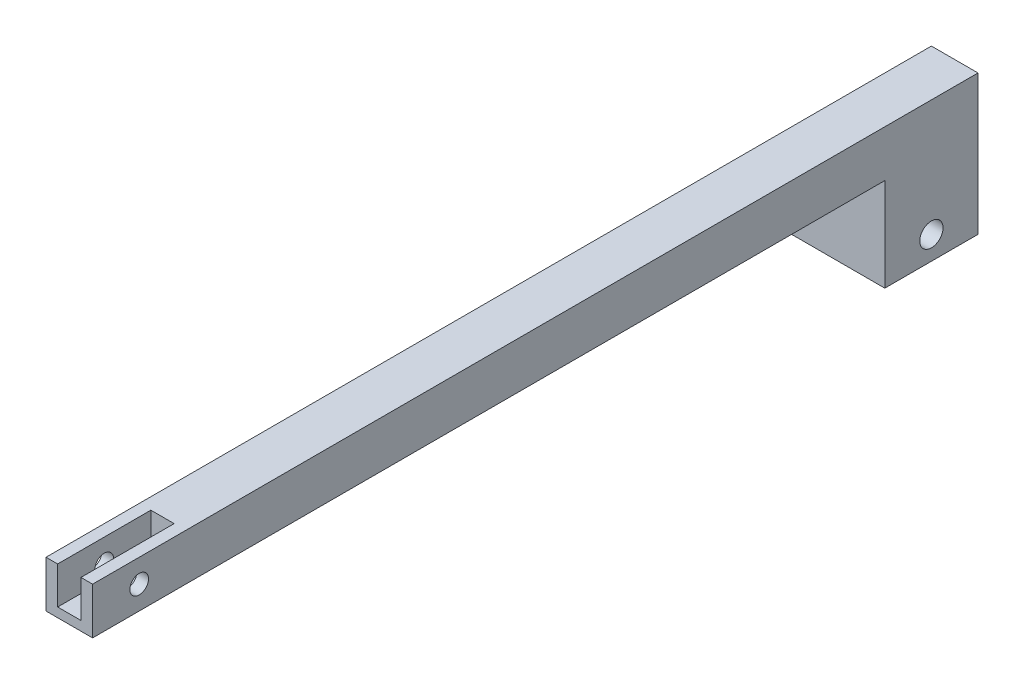
ISO-10303-21;
HEADER;
FILE_DESCRIPTION(('STEP AP214'),'2;1');
FILE_NAME('part.step','',(''),(''),'','','');
FILE_SCHEMA(('AUTOMOTIVE_DESIGN { 1 0 10303 214 1 1 1 1 }'));
ENDSEC;
DATA;
#1=APPLICATION_CONTEXT('core data for automotive mechanical design processes');
#2=APPLICATION_PROTOCOL_DEFINITION('international standard','automotive_design',2000,#1);
#3=PRODUCT_CONTEXT('',#1,'mechanical');
#4=PRODUCT('Part','Part','',(#3));
#5=PRODUCT_RELATED_PRODUCT_CATEGORY('part','',(#4));
#6=PRODUCT_DEFINITION_FORMATION('','',#4);
#7=PRODUCT_DEFINITION_CONTEXT('part definition',#1,'design');
#8=PRODUCT_DEFINITION('design','',#6,#7);
#9=PRODUCT_DEFINITION_SHAPE('','',#8);
#10=(LENGTH_UNIT() NAMED_UNIT(*) SI_UNIT(.MILLI.,.METRE.));
#11=(NAMED_UNIT(*) PLANE_ANGLE_UNIT() SI_UNIT($,.RADIAN.));
#12=(NAMED_UNIT(*) SI_UNIT($,.STERADIAN.) SOLID_ANGLE_UNIT());
#13=UNCERTAINTY_MEASURE_WITH_UNIT(LENGTH_MEASURE(1.E-05),#10,'distance_accuracy_value','');
#14=(GEOMETRIC_REPRESENTATION_CONTEXT(3) GLOBAL_UNCERTAINTY_ASSIGNED_CONTEXT((#13)) GLOBAL_UNIT_ASSIGNED_CONTEXT((#10,
#11,#12)) REPRESENTATION_CONTEXT('',''));
#15=CARTESIAN_POINT('',(0.,0.,0.));
#16=DIRECTION('',(0.,0.,1.));
#17=DIRECTION('',(1.,0.,0.));
#18=AXIS2_PLACEMENT_3D('',#15,#16,#17);
#19=CARTESIAN_POINT('',(0.,0.,190.));
#20=DIRECTION('',(0.,0.,-1.));
#21=DIRECTION('',(-1.,0.,0.));
#22=AXIS2_PLACEMENT_3D('',#19,#20,#21);
#23=PLANE('',#22);
#24=DIRECTION('',(1.,0.,0.));
#25=VECTOR('',#24,1.);
#26=CARTESIAN_POINT('',(12.5,22.,190.));
#27=LINE('',#26,#25);
#28=CARTESIAN_POINT('',(12.5,22.,190.));
#29=VERTEX_POINT('',#28);
#30=CARTESIAN_POINT('',(17.5,22.,190.));
#31=VERTEX_POINT('',#30);
#32=EDGE_CURVE('E146',#29,#31,#27,.T.);
#33=ORIENTED_EDGE('',*,*,#32,.F.);
#34=DIRECTION('',(0.,1.,0.));
#35=VECTOR('',#34,1.);
#36=CARTESIAN_POINT('',(12.5,25.,190.));
#37=LINE('',#36,#35);
#38=CARTESIAN_POINT('',(12.5,30.,190.));
#39=VERTEX_POINT('',#38);
#40=EDGE_CURVE('E130',#29,#39,#37,.T.);
#41=ORIENTED_EDGE('',*,*,#40,.T.);
#42=DIRECTION('',(-1.,0.,0.));
#43=VECTOR('',#42,1.);
#44=CARTESIAN_POINT('',(10.,30.,190.));
#45=LINE('',#44,#43);
#46=CARTESIAN_POINT('',(10.,30.,190.));
#47=VERTEX_POINT('',#46);
#48=EDGE_CURVE('E197',#39,#47,#45,.T.);
#49=ORIENTED_EDGE('',*,*,#48,.T.);
#50=DIRECTION('',(0.,-1.,0.));
#51=VECTOR('',#50,1.);
#52=CARTESIAN_POINT('',(10.,10.,190.));
#53=LINE('',#52,#51);
#54=CARTESIAN_POINT('',(10.,20.,190.));
#55=VERTEX_POINT('',#54);
#56=EDGE_CURVE('E201',#47,#55,#53,.T.);
#57=ORIENTED_EDGE('',*,*,#56,.T.);
#58=DIRECTION('',(-1.,0.,0.));
#59=VECTOR('',#58,1.);
#60=CARTESIAN_POINT('',(20.,20.,190.));
#61=LINE('',#60,#59);
#62=CARTESIAN_POINT('',(20.,20.,190.));
#63=VERTEX_POINT('',#62);
#64=EDGE_CURVE('E181',#63,#55,#61,.T.);
#65=ORIENTED_EDGE('',*,*,#64,.F.);
#66=DIRECTION('',(0.,1.,0.));
#67=VECTOR('',#66,1.);
#68=CARTESIAN_POINT('',(20.,30.,190.));
#69=LINE('',#68,#67);
#70=CARTESIAN_POINT('',(20.,30.,190.));
#71=VERTEX_POINT('',#70);
#72=EDGE_CURVE('E195',#63,#71,#69,.T.);
#73=ORIENTED_EDGE('',*,*,#72,.T.);
#74=CARTESIAN_POINT('',(17.5,30.,190.));
#75=VERTEX_POINT('',#74);
#76=EDGE_CURVE('E199',#71,#75,#45,.T.);
#77=ORIENTED_EDGE('',*,*,#76,.T.);
#78=DIRECTION('',(0.,1.,0.));
#79=VECTOR('',#78,1.);
#80=CARTESIAN_POINT('',(17.5,25.,190.));
#81=LINE('',#80,#79);
#82=EDGE_CURVE('E55',#31,#75,#81,.T.);
#83=ORIENTED_EDGE('',*,*,#82,.F.);
#84=EDGE_LOOP('',(#33,#41,#49,#57,#65,#73,#77,#83));
#85=FACE_BOUND('',#84,.T.);
#86=ADVANCED_FACE('F39',(#85),#23,.F.);
#87=CARTESIAN_POINT('',(20.,0.,190.));
#88=DIRECTION('',(0.,1.,0.));
#89=DIRECTION('',(-1.,0.,0.));
#90=AXIS2_PLACEMENT_3D('',#87,#88,#89);
#91=PLANE('',#90);
#92=DIRECTION('',(1.,0.,0.));
#93=VECTOR('',#92,1.);
#94=CARTESIAN_POINT('',(20.,0.,20.));
#95=LINE('',#94,#93);
#96=CARTESIAN_POINT('',(0.,0.,20.));
#97=VERTEX_POINT('',#96);
#98=CARTESIAN_POINT('',(20.,0.,20.));
#99=VERTEX_POINT('',#98);
#100=EDGE_CURVE('E179',#97,#99,#95,.T.);
#101=ORIENTED_EDGE('',*,*,#100,.F.);
#102=DIRECTION('',(0.,0.,-1.));
#103=VECTOR('',#102,1.);
#104=CARTESIAN_POINT('',(0.,0.,190.));
#105=LINE('',#104,#103);
#106=CARTESIAN_POINT('',(0.,0.,0.));
#107=VERTEX_POINT('',#106);
#108=EDGE_CURVE('E204',#97,#107,#105,.T.);
#109=ORIENTED_EDGE('',*,*,#108,.T.);
#110=DIRECTION('',(1.,0.,0.));
#111=VECTOR('',#110,1.);
#112=CARTESIAN_POINT('',(20.,0.,0.));
#113=LINE('',#112,#111);
#114=CARTESIAN_POINT('',(20.,0.,0.));
#115=VERTEX_POINT('',#114);
#116=EDGE_CURVE('E192',#107,#115,#113,.T.);
#117=ORIENTED_EDGE('',*,*,#116,.T.);
#118=DIRECTION('',(0.,0.,-1.));
#119=VECTOR('',#118,1.);
#120=CARTESIAN_POINT('',(20.,0.,190.));
#121=LINE('',#120,#119);
#122=EDGE_CURVE('E11',#99,#115,#121,.T.);
#123=ORIENTED_EDGE('',*,*,#122,.F.);
#124=EDGE_LOOP('',(#101,#109,#117,#123));
#125=FACE_BOUND('',#124,.T.);
#126=ADVANCED_FACE('F41',(#125),#91,.F.);
#127=CARTESIAN_POINT('',(20.,30.,190.));
#128=DIRECTION('',(-1.,0.,0.));
#129=DIRECTION('',(0.,-1.,0.));
#130=AXIS2_PLACEMENT_3D('',#127,#128,#129);
#131=PLANE('',#130);
#132=CARTESIAN_POINT('',(20.,25.,180.));
#133=DIRECTION('',(-1.,0.,0.));
#134=DIRECTION('',(0.,0.,1.));
#135=AXIS2_PLACEMENT_3D('',#132,#133,#134);
#136=CIRCLE('',#135,2.);
#137=CARTESIAN_POINT('',(20.,25.,182.));
#138=VERTEX_POINT('',#137);
#139=EDGE_CURVE('E301',#138,#138,#136,.T.);
#140=ORIENTED_EDGE('',*,*,#139,.T.);
#141=EDGE_LOOP('',(#140));
#142=FACE_BOUND('',#141,.T.);
#143=CARTESIAN_POINT('',(20.,5.,9.99999999999999));
#144=DIRECTION('',(-1.,0.,0.));
#145=DIRECTION('',(0.,0.,1.));
#146=AXIS2_PLACEMENT_3D('',#143,#144,#145);
#147=CIRCLE('',#146,2.5);
#148=CARTESIAN_POINT('',(20.,5.,12.5));
#149=VERTEX_POINT('',#148);
#150=EDGE_CURVE('E158',#149,#149,#147,.T.);
#151=ORIENTED_EDGE('',*,*,#150,.T.);
#152=EDGE_LOOP('',(#151));
#153=FACE_BOUND('',#152,.T.);
#154=DIRECTION('',(0.,0.,1.));
#155=VECTOR('',#154,1.);
#156=CARTESIAN_POINT('',(20.,20.,20.));
#157=LINE('',#156,#155);
#158=CARTESIAN_POINT('',(20.,20.,20.));
#159=VERTEX_POINT('',#158);
#160=EDGE_CURVE('E63',#159,#63,#157,.T.);
#161=ORIENTED_EDGE('',*,*,#160,.F.);
#162=DIRECTION('',(0.,-1.,0.));
#163=VECTOR('',#162,1.);
#164=CARTESIAN_POINT('',(20.,20.,20.));
#165=LINE('',#164,#163);
#166=EDGE_CURVE('E189',#159,#99,#165,.T.);
#167=ORIENTED_EDGE('',*,*,#166,.T.);
#168=ORIENTED_EDGE('',*,*,#122,.T.);
#169=DIRECTION('',(0.,1.,0.));
#170=VECTOR('',#169,1.);
#171=CARTESIAN_POINT('',(20.,30.,0.));
#172=LINE('',#171,#170);
#173=CARTESIAN_POINT('',(20.,30.,0.));
#174=VERTEX_POINT('',#173);
#175=EDGE_CURVE('E207',#115,#174,#172,.T.);
#176=ORIENTED_EDGE('',*,*,#175,.T.);
#177=DIRECTION('',(0.,0.,-1.));
#178=VECTOR('',#177,1.);
#179=CARTESIAN_POINT('',(20.,30.,190.));
#180=LINE('',#179,#178);
#181=EDGE_CURVE('E48',#71,#174,#180,.T.);
#182=ORIENTED_EDGE('',*,*,#181,.F.);
#183=ORIENTED_EDGE('',*,*,#72,.F.);
#184=EDGE_LOOP('',(#161,#167,#168,#176,#182,#183));
#185=FACE_BOUND('',#184,.T.);
#186=ADVANCED_FACE('F250',(#142,#153,#185),#131,.F.);
#187=CARTESIAN_POINT('',(10.,30.,190.));
#188=DIRECTION('',(0.,-1.,0.));
#189=DIRECTION('',(0.,0.,-1.));
#190=AXIS2_PLACEMENT_3D('',#187,#188,#189);
#191=PLANE('',#190);
#192=ORIENTED_EDGE('',*,*,#48,.F.);
#193=DIRECTION('',(0.,0.,1.));
#194=VECTOR('',#193,1.);
#195=CARTESIAN_POINT('',(12.5,30.,170.));
#196=LINE('',#195,#194);
#197=CARTESIAN_POINT('',(12.5,30.,170.));
#198=VERTEX_POINT('',#197);
#199=EDGE_CURVE('E136',#198,#39,#196,.T.);
#200=ORIENTED_EDGE('',*,*,#199,.F.);
#201=DIRECTION('',(-1.,0.,0.));
#202=VECTOR('',#201,1.);
#203=CARTESIAN_POINT('',(12.5,30.,170.));
#204=LINE('',#203,#202);
#205=CARTESIAN_POINT('',(17.5,30.,170.));
#206=VERTEX_POINT('',#205);
#207=EDGE_CURVE('E140',#206,#198,#204,.T.);
#208=ORIENTED_EDGE('',*,*,#207,.F.);
#209=DIRECTION('',(0.,0.,-1.));
#210=VECTOR('',#209,1.);
#211=CARTESIAN_POINT('',(17.5,30.,170.));
#212=LINE('',#211,#210);
#213=EDGE_CURVE('E165',#75,#206,#212,.T.);
#214=ORIENTED_EDGE('',*,*,#213,.F.);
#215=ORIENTED_EDGE('',*,*,#76,.F.);
#216=ORIENTED_EDGE('',*,*,#181,.T.);
#217=DIRECTION('',(-1.,0.,0.));
#218=VECTOR('',#217,1.);
#219=CARTESIAN_POINT('',(10.,30.,0.));
#220=LINE('',#219,#218);
#221=CARTESIAN_POINT('',(10.,30.,0.));
#222=VERTEX_POINT('',#221);
#223=EDGE_CURVE('E209',#174,#222,#220,.T.);
#224=ORIENTED_EDGE('',*,*,#223,.T.);
#225=DIRECTION('',(0.,0.,-1.));
#226=VECTOR('',#225,1.);
#227=CARTESIAN_POINT('',(10.,30.,190.));
#228=LINE('',#227,#226);
#229=EDGE_CURVE('E224',#47,#222,#228,.T.);
#230=ORIENTED_EDGE('',*,*,#229,.F.);
#231=EDGE_LOOP('',(#192,#200,#208,#214,#215,#216,#224,#230));
#232=FACE_BOUND('',#231,.T.);
#233=ADVANCED_FACE('F232',(#232),#191,.F.);
#234=CARTESIAN_POINT('',(10.,10.,190.));
#235=DIRECTION('',(1.,0.,0.));
#236=DIRECTION('',(0.,0.,-1.));
#237=AXIS2_PLACEMENT_3D('',#234,#235,#236);
#238=PLANE('',#237);
#239=CARTESIAN_POINT('',(10.,25.,180.));
#240=DIRECTION('',(-1.,0.,0.));
#241=DIRECTION('',(0.,0.,1.));
#242=AXIS2_PLACEMENT_3D('',#239,#240,#241);
#243=CIRCLE('',#242,2.);
#244=CARTESIAN_POINT('',(10.,25.,182.));
#245=VERTEX_POINT('',#244);
#246=EDGE_CURVE('E506',#245,#245,#243,.T.);
#247=ORIENTED_EDGE('',*,*,#246,.F.);
#248=EDGE_LOOP('',(#247));
#249=FACE_BOUND('',#248,.T.);
#250=DIRECTION('',(0.,0.,-1.));
#251=VECTOR('',#250,1.);
#252=CARTESIAN_POINT('',(10.,10.,190.));
#253=LINE('',#252,#251);
#254=CARTESIAN_POINT('',(10.,10.,20.));
#255=VERTEX_POINT('',#254);
#256=CARTESIAN_POINT('',(10.,10.,0.));
#257=VERTEX_POINT('',#256);
#258=EDGE_CURVE('E222',#255,#257,#253,.T.);
#259=ORIENTED_EDGE('',*,*,#258,.F.);
#260=DIRECTION('',(0.,-1.,0.));
#261=VECTOR('',#260,1.);
#262=CARTESIAN_POINT('',(10.,20.,20.));
#263=LINE('',#262,#261);
#264=CARTESIAN_POINT('',(10.,20.,20.));
#265=VERTEX_POINT('',#264);
#266=EDGE_CURVE('E187',#265,#255,#263,.T.);
#267=ORIENTED_EDGE('',*,*,#266,.F.);
#268=DIRECTION('',(0.,0.,-1.));
#269=VECTOR('',#268,1.);
#270=CARTESIAN_POINT('',(10.,20.,20.));
#271=LINE('',#270,#269);
#272=EDGE_CURVE('E183',#55,#265,#271,.T.);
#273=ORIENTED_EDGE('',*,*,#272,.F.);
#274=ORIENTED_EDGE('',*,*,#56,.F.);
#275=ORIENTED_EDGE('',*,*,#229,.T.);
#276=DIRECTION('',(0.,-1.,0.));
#277=VECTOR('',#276,1.);
#278=CARTESIAN_POINT('',(10.,10.,0.));
#279=LINE('',#278,#277);
#280=EDGE_CURVE('E211',#222,#257,#279,.T.);
#281=ORIENTED_EDGE('',*,*,#280,.T.);
#282=EDGE_LOOP('',(#259,#267,#273,#274,#275,#281));
#283=FACE_BOUND('',#282,.T.);
#284=ADVANCED_FACE('F245',(#249,#283),#238,.F.);
#285=CARTESIAN_POINT('',(0.,10.,190.));
#286=DIRECTION('',(0.,-1.,0.));
#287=DIRECTION('',(0.,0.,-1.));
#288=AXIS2_PLACEMENT_3D('',#285,#286,#287);
#289=PLANE('',#288);
#290=DIRECTION('',(0.,0.,-1.));
#291=VECTOR('',#290,1.);
#292=CARTESIAN_POINT('',(0.,10.,190.));
#293=LINE('',#292,#291);
#294=CARTESIAN_POINT('',(0.,10.,20.));
#295=VERTEX_POINT('',#294);
#296=CARTESIAN_POINT('',(0.,10.,0.));
#297=VERTEX_POINT('',#296);
#298=EDGE_CURVE('E220',#295,#297,#293,.T.);
#299=ORIENTED_EDGE('',*,*,#298,.F.);
#300=DIRECTION('',(1.,0.,0.));
#301=VECTOR('',#300,1.);
#302=CARTESIAN_POINT('',(-10.,10.,20.));
#303=LINE('',#302,#301);
#304=EDGE_CURVE('E171',#295,#255,#303,.T.);
#305=ORIENTED_EDGE('',*,*,#304,.T.);
#306=ORIENTED_EDGE('',*,*,#258,.T.);
#307=DIRECTION('',(-1.,0.,0.));
#308=VECTOR('',#307,1.);
#309=CARTESIAN_POINT('',(0.,10.,0.));
#310=LINE('',#309,#308);
#311=EDGE_CURVE('E214',#257,#297,#310,.T.);
#312=ORIENTED_EDGE('',*,*,#311,.T.);
#313=EDGE_LOOP('',(#299,#305,#306,#312));
#314=FACE_BOUND('',#313,.T.);
#315=ADVANCED_FACE('F262',(#314),#289,.F.);
#316=CARTESIAN_POINT('',(0.,0.,190.));
#317=DIRECTION('',(1.,0.,0.));
#318=DIRECTION('',(0.,0.,-1.));
#319=AXIS2_PLACEMENT_3D('',#316,#317,#318);
#320=PLANE('',#319);
#321=ORIENTED_EDGE('',*,*,#108,.F.);
#322=DIRECTION('',(0.,1.,0.));
#323=VECTOR('',#322,1.);
#324=CARTESIAN_POINT('',(0.,0.,20.));
#325=LINE('',#324,#323);
#326=EDGE_CURVE('E176',#97,#295,#325,.T.);
#327=ORIENTED_EDGE('',*,*,#326,.T.);
#328=ORIENTED_EDGE('',*,*,#298,.T.);
#329=DIRECTION('',(0.,-1.,0.));
#330=VECTOR('',#329,1.);
#331=CARTESIAN_POINT('',(0.,0.,0.));
#332=LINE('',#331,#330);
#333=EDGE_CURVE('E198',#297,#107,#332,.T.);
#334=ORIENTED_EDGE('',*,*,#333,.T.);
#335=EDGE_LOOP('',(#321,#327,#328,#334));
#336=FACE_BOUND('',#335,.T.);
#337=CARTESIAN_POINT('',(0.,5.,9.99999999999999));
#338=DIRECTION('',(-1.,0.,0.));
#339=DIRECTION('',(0.,0.,1.));
#340=AXIS2_PLACEMENT_3D('',#337,#338,#339);
#341=CIRCLE('',#340,2.5);
#342=CARTESIAN_POINT('',(0.,5.,12.5));
#343=VERTEX_POINT('',#342);
#344=EDGE_CURVE('E161',#343,#343,#341,.T.);
#345=ORIENTED_EDGE('',*,*,#344,.F.);
#346=EDGE_LOOP('',(#345));
#347=FACE_BOUND('',#346,.T.);
#348=ADVANCED_FACE('F258',(#336,#347),#320,.F.);
#349=CARTESIAN_POINT('',(0.,0.,0.));
#350=DIRECTION('',(0.,0.,-1.));
#351=DIRECTION('',(-1.,0.,0.));
#352=AXIS2_PLACEMENT_3D('',#349,#350,#351);
#353=PLANE('',#352);
#354=ORIENTED_EDGE('',*,*,#116,.F.);
#355=ORIENTED_EDGE('',*,*,#333,.F.);
#356=ORIENTED_EDGE('',*,*,#311,.F.);
#357=ORIENTED_EDGE('',*,*,#280,.F.);
#358=ORIENTED_EDGE('',*,*,#223,.F.);
#359=ORIENTED_EDGE('',*,*,#175,.F.);
#360=EDGE_LOOP('',(#354,#355,#356,#357,#358,#359));
#361=FACE_BOUND('',#360,.T.);
#362=ADVANCED_FACE('F240',(#361),#353,.T.);
#363=CARTESIAN_POINT('',(20.,20.,20.));
#364=DIRECTION('',(0.,0.,-1.));
#365=DIRECTION('',(-1.,0.,0.));
#366=AXIS2_PLACEMENT_3D('',#363,#364,#365);
#367=PLANE('',#366);
#368=ORIENTED_EDGE('',*,*,#100,.T.);
#369=ORIENTED_EDGE('',*,*,#166,.F.);
#370=DIRECTION('',(1.,0.,0.));
#371=VECTOR('',#370,1.);
#372=CARTESIAN_POINT('',(20.,20.,20.));
#373=LINE('',#372,#371);
#374=EDGE_CURVE('E185',#265,#159,#373,.T.);
#375=ORIENTED_EDGE('',*,*,#374,.F.);
#376=ORIENTED_EDGE('',*,*,#266,.T.);
#377=ORIENTED_EDGE('',*,*,#304,.F.);
#378=ORIENTED_EDGE('',*,*,#326,.F.);
#379=EDGE_LOOP('',(#368,#369,#375,#376,#377,#378));
#380=FACE_BOUND('',#379,.T.);
#381=ADVANCED_FACE('F263',(#380),#367,.F.);
#382=CARTESIAN_POINT('',(0.,20.,0.));
#383=DIRECTION('',(0.,-1.,0.));
#384=DIRECTION('',(1.,0.,0.));
#385=AXIS2_PLACEMENT_3D('',#382,#383,#384);
#386=PLANE('',#385);
#387=ORIENTED_EDGE('',*,*,#160,.T.);
#388=ORIENTED_EDGE('',*,*,#64,.T.);
#389=ORIENTED_EDGE('',*,*,#272,.T.);
#390=ORIENTED_EDGE('',*,*,#374,.T.);
#391=EDGE_LOOP('',(#387,#388,#389,#390));
#392=FACE_BOUND('',#391,.T.);
#393=ADVANCED_FACE('F264',(#392),#386,.T.);
#394=CARTESIAN_POINT('',(12.5,25.,170.));
#395=DIRECTION('',(-1.,0.,0.));
#396=DIRECTION('',(0.,0.,1.));
#397=AXIS2_PLACEMENT_3D('',#394,#395,#396);
#398=PLANE('',#397);
#399=CARTESIAN_POINT('',(12.5,25.,180.));
#400=DIRECTION('',(-1.,0.,0.));
#401=DIRECTION('',(0.,0.,1.));
#402=AXIS2_PLACEMENT_3D('',#399,#400,#401);
#403=CIRCLE('',#402,2.);
#404=CARTESIAN_POINT('',(12.5,25.,182.));
#405=VERTEX_POINT('',#404);
#406=EDGE_CURVE('E149',#405,#405,#403,.T.);
#407=ORIENTED_EDGE('',*,*,#406,.T.);
#408=EDGE_LOOP('',(#407));
#409=FACE_BOUND('',#408,.T.);
#410=ORIENTED_EDGE('',*,*,#199,.T.);
#411=ORIENTED_EDGE('',*,*,#40,.F.);
#412=DIRECTION('',(0.,0.,1.));
#413=VECTOR('',#412,1.);
#414=CARTESIAN_POINT('',(12.5,22.,170.));
#415=LINE('',#414,#413);
#416=CARTESIAN_POINT('',(12.5,22.,170.));
#417=VERTEX_POINT('',#416);
#418=EDGE_CURVE('E133',#417,#29,#415,.T.);
#419=ORIENTED_EDGE('',*,*,#418,.F.);
#420=DIRECTION('',(0.,1.,0.));
#421=VECTOR('',#420,1.);
#422=CARTESIAN_POINT('',(12.5,25.,170.));
#423=LINE('',#422,#421);
#424=EDGE_CURVE('E169',#417,#198,#423,.T.);
#425=ORIENTED_EDGE('',*,*,#424,.T.);
#426=EDGE_LOOP('',(#410,#411,#419,#425));
#427=FACE_BOUND('',#426,.T.);
#428=ADVANCED_FACE('F132',(#409,#427),#398,.F.);
#429=CARTESIAN_POINT('',(12.5,25.,170.));
#430=DIRECTION('',(0.,0.,-1.));
#431=DIRECTION('',(-1.,0.,0.));
#432=AXIS2_PLACEMENT_3D('',#429,#430,#431);
#433=PLANE('',#432);
#434=ORIENTED_EDGE('',*,*,#207,.T.);
#435=ORIENTED_EDGE('',*,*,#424,.F.);
#436=DIRECTION('',(-1.,0.,0.));
#437=VECTOR('',#436,1.);
#438=CARTESIAN_POINT('',(12.5,22.,170.));
#439=LINE('',#438,#437);
#440=CARTESIAN_POINT('',(17.5,22.,170.));
#441=VERTEX_POINT('',#440);
#442=EDGE_CURVE('E148',#441,#417,#439,.T.);
#443=ORIENTED_EDGE('',*,*,#442,.F.);
#444=DIRECTION('',(0.,1.,0.));
#445=VECTOR('',#444,1.);
#446=CARTESIAN_POINT('',(17.5,25.,170.));
#447=LINE('',#446,#445);
#448=EDGE_CURVE('E172',#441,#206,#447,.T.);
#449=ORIENTED_EDGE('',*,*,#448,.T.);
#450=EDGE_LOOP('',(#434,#435,#443,#449));
#451=FACE_BOUND('',#450,.T.);
#452=ADVANCED_FACE('F272',(#451),#433,.F.);
#453=CARTESIAN_POINT('',(17.5,25.,170.));
#454=DIRECTION('',(1.,0.,0.));
#455=DIRECTION('',(0.,0.,-1.));
#456=AXIS2_PLACEMENT_3D('',#453,#454,#455);
#457=PLANE('',#456);
#458=CARTESIAN_POINT('',(17.5,25.,180.));
#459=DIRECTION('',(1.,0.,0.));
#460=DIRECTION('',(0.,0.,-1.));
#461=AXIS2_PLACEMENT_3D('',#458,#459,#460);
#462=CIRCLE('',#461,2.);
#463=CARTESIAN_POINT('',(17.5,25.,178.));
#464=VERTEX_POINT('',#463);
#465=EDGE_CURVE('E43',#464,#464,#462,.T.);
#466=ORIENTED_EDGE('',*,*,#465,.T.);
#467=EDGE_LOOP('',(#466));
#468=FACE_BOUND('',#467,.T.);
#469=ORIENTED_EDGE('',*,*,#213,.T.);
#470=ORIENTED_EDGE('',*,*,#448,.F.);
#471=DIRECTION('',(0.,0.,-1.));
#472=VECTOR('',#471,1.);
#473=CARTESIAN_POINT('',(17.5,22.,170.));
#474=LINE('',#473,#472);
#475=EDGE_CURVE('E152',#31,#441,#474,.T.);
#476=ORIENTED_EDGE('',*,*,#475,.F.);
#477=ORIENTED_EDGE('',*,*,#82,.T.);
#478=EDGE_LOOP('',(#469,#470,#476,#477));
#479=FACE_BOUND('',#478,.T.);
#480=ADVANCED_FACE('F306',(#468,#479),#457,.F.);
#481=CARTESIAN_POINT('',(20.,5.,9.99999999999999));
#482=DIRECTION('',(-1.,0.,0.));
#483=DIRECTION('',(0.,0.,1.));
#484=AXIS2_PLACEMENT_3D('',#481,#482,#483);
#485=CYLINDRICAL_SURFACE('',#484,2.5);
#486=ORIENTED_EDGE('',*,*,#344,.T.);
#487=EDGE_LOOP('',(#486));
#488=FACE_BOUND('',#487,.T.);
#489=ORIENTED_EDGE('',*,*,#150,.F.);
#490=EDGE_LOOP('',(#489));
#491=FACE_BOUND('',#490,.T.);
#492=ADVANCED_FACE('F304',(#488,#491),#485,.F.);
#493=CARTESIAN_POINT('',(0.,22.,0.));
#494=DIRECTION('',(0.,1.,0.));
#495=DIRECTION('',(0.,0.,1.));
#496=AXIS2_PLACEMENT_3D('',#493,#494,#495);
#497=PLANE('',#496);
#498=ORIENTED_EDGE('',*,*,#418,.T.);
#499=ORIENTED_EDGE('',*,*,#32,.T.);
#500=ORIENTED_EDGE('',*,*,#475,.T.);
#501=ORIENTED_EDGE('',*,*,#442,.T.);
#502=EDGE_LOOP('',(#498,#499,#500,#501));
#503=FACE_BOUND('',#502,.T.);
#504=ADVANCED_FACE('F144',(#503),#497,.T.);
#505=CARTESIAN_POINT('',(20.,25.,180.));
#506=DIRECTION('',(-1.,0.,0.));
#507=DIRECTION('',(0.,0.,1.));
#508=AXIS2_PLACEMENT_3D('',#505,#506,#507);
#509=CYLINDRICAL_SURFACE('',#508,2.);
#510=ORIENTED_EDGE('',*,*,#139,.F.);
#511=EDGE_LOOP('',(#510));
#512=FACE_BOUND('',#511,.T.);
#513=ORIENTED_EDGE('',*,*,#465,.F.);
#514=EDGE_LOOP('',(#513));
#515=FACE_BOUND('',#514,.T.);
#516=ADVANCED_FACE('F313',(#512,#515),#509,.F.);
#517=ORIENTED_EDGE('',*,*,#246,.T.);
#518=EDGE_LOOP('',(#517));
#519=FACE_BOUND('',#518,.T.);
#520=ORIENTED_EDGE('',*,*,#406,.F.);
#521=EDGE_LOOP('',(#520));
#522=FACE_BOUND('',#521,.T.);
#523=ADVANCED_FACE('F347',(#519,#522),#509,.F.);
#524=CLOSED_SHELL('',(#86,#126,#186,#233,#284,#315,#348,#362,#381,#393,#428,#452,#480,#492,#504,
#516,#523));
#525=MANIFOLD_SOLID_BREP('B2',#524);
#526=ADVANCED_BREP_SHAPE_REPRESENTATION('',(#18,#525),#14);
#527=SHAPE_DEFINITION_REPRESENTATION(#9,#526);
ENDSEC;
END-ISO-10303-21;
